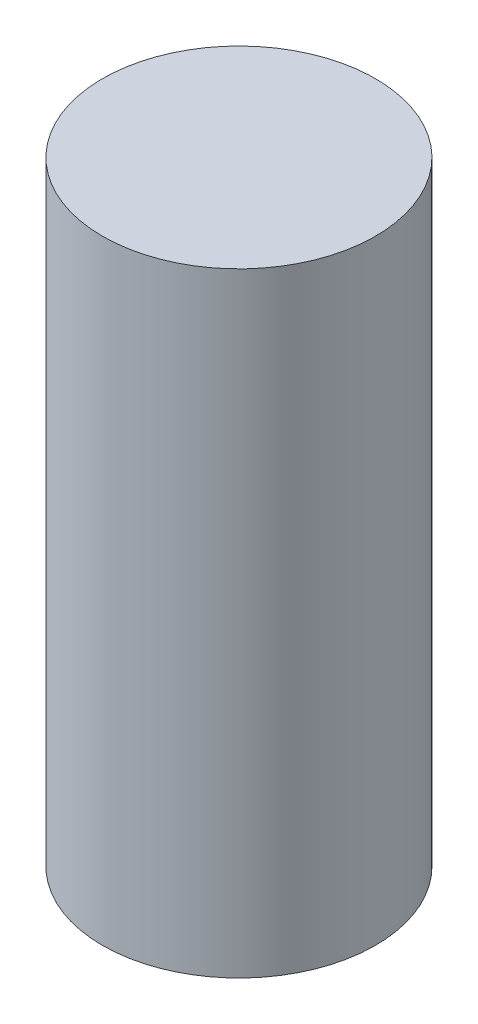
ISO-10303-21;
HEADER;
FILE_DESCRIPTION(('STEP AP214'),'2;1');
FILE_NAME('part.step','',(''),(''),'','','');
FILE_SCHEMA(('AUTOMOTIVE_DESIGN { 1 0 10303 214 1 1 1 1 }'));
ENDSEC;
DATA;
#1=APPLICATION_CONTEXT('core data for automotive mechanical design processes');
#2=APPLICATION_PROTOCOL_DEFINITION('international standard','automotive_design',2000,#1);
#3=PRODUCT_CONTEXT('',#1,'mechanical');
#4=PRODUCT('Part','Part','',(#3));
#5=PRODUCT_RELATED_PRODUCT_CATEGORY('part','',(#4));
#6=PRODUCT_DEFINITION_FORMATION('','',#4);
#7=PRODUCT_DEFINITION_CONTEXT('part definition',#1,'design');
#8=PRODUCT_DEFINITION('design','',#6,#7);
#9=PRODUCT_DEFINITION_SHAPE('','',#8);
#10=(LENGTH_UNIT() NAMED_UNIT(*) SI_UNIT(.MILLI.,.METRE.));
#11=(NAMED_UNIT(*) PLANE_ANGLE_UNIT() SI_UNIT($,.RADIAN.));
#12=(NAMED_UNIT(*) SI_UNIT($,.STERADIAN.) SOLID_ANGLE_UNIT());
#13=UNCERTAINTY_MEASURE_WITH_UNIT(LENGTH_MEASURE(1.E-05),#10,'distance_accuracy_value','');
#14=(GEOMETRIC_REPRESENTATION_CONTEXT(3) GLOBAL_UNCERTAINTY_ASSIGNED_CONTEXT((#13)) GLOBAL_UNIT_ASSIGNED_CONTEXT((#10,
#11,#12)) REPRESENTATION_CONTEXT('',''));
#15=CARTESIAN_POINT('',(0.,0.,0.));
#16=DIRECTION('',(0.,0.,1.));
#17=DIRECTION('',(1.,0.,0.));
#18=AXIS2_PLACEMENT_3D('',#15,#16,#17);
#19=CARTESIAN_POINT('',(0.,18.,0.));
#20=DIRECTION('',(0.,-1.,0.));
#21=DIRECTION('',(0.,0.,-1.));
#22=AXIS2_PLACEMENT_3D('',#19,#20,#21);
#23=CYLINDRICAL_SURFACE('',#22,4.);
#24=CARTESIAN_POINT('',(0.,18.,0.));
#25=DIRECTION('',(0.,1.,0.));
#26=DIRECTION('',(0.,0.,1.));
#27=AXIS2_PLACEMENT_3D('',#24,#25,#26);
#28=CIRCLE('',#27,4.);
#29=CARTESIAN_POINT('',(0.,18.,4.));
#30=VERTEX_POINT('',#29);
#31=EDGE_CURVE('E10',#30,#30,#28,.T.);
#32=ORIENTED_EDGE('',*,*,#31,.F.);
#33=EDGE_LOOP('',(#32));
#34=FACE_BOUND('',#33,.T.);
#35=CARTESIAN_POINT('',(0.,0.,0.));
#36=DIRECTION('',(0.,1.,0.));
#37=DIRECTION('',(0.,0.,1.));
#38=AXIS2_PLACEMENT_3D('',#35,#36,#37);
#39=CIRCLE('',#38,4.);
#40=CARTESIAN_POINT('',(0.,0.,4.));
#41=VERTEX_POINT('',#40);
#42=EDGE_CURVE('E33',#41,#41,#39,.T.);
#43=ORIENTED_EDGE('',*,*,#42,.T.);
#44=EDGE_LOOP('',(#43));
#45=FACE_BOUND('',#44,.T.);
#46=ADVANCED_FACE('F30',(#34,#45),#23,.T.);
#47=CARTESIAN_POINT('',(0.,18.,0.));
#48=DIRECTION('',(0.,1.,0.));
#49=DIRECTION('',(0.,0.,1.));
#50=AXIS2_PLACEMENT_3D('',#47,#48,#49);
#51=PLANE('',#50);
#52=ORIENTED_EDGE('',*,*,#31,.T.);
#53=EDGE_LOOP('',(#52));
#54=FACE_BOUND('',#53,.T.);
#55=ADVANCED_FACE('F45',(#54),#51,.T.);
#56=CARTESIAN_POINT('',(0.,0.,0.));
#57=DIRECTION('',(0.,1.,0.));
#58=DIRECTION('',(0.,0.,1.));
#59=AXIS2_PLACEMENT_3D('',#56,#57,#58);
#60=PLANE('',#59);
#61=ORIENTED_EDGE('',*,*,#42,.F.);
#62=EDGE_LOOP('',(#61));
#63=FACE_BOUND('',#62,.T.);
#64=ADVANCED_FACE('F43',(#63),#60,.F.);
#65=CLOSED_SHELL('',(#46,#55,#64));
#66=MANIFOLD_SOLID_BREP('B2',#65);
#67=ADVANCED_BREP_SHAPE_REPRESENTATION('',(#18,#66),#14);
#68=SHAPE_DEFINITION_REPRESENTATION(#9,#67);
ENDSEC;
END-ISO-10303-21;
